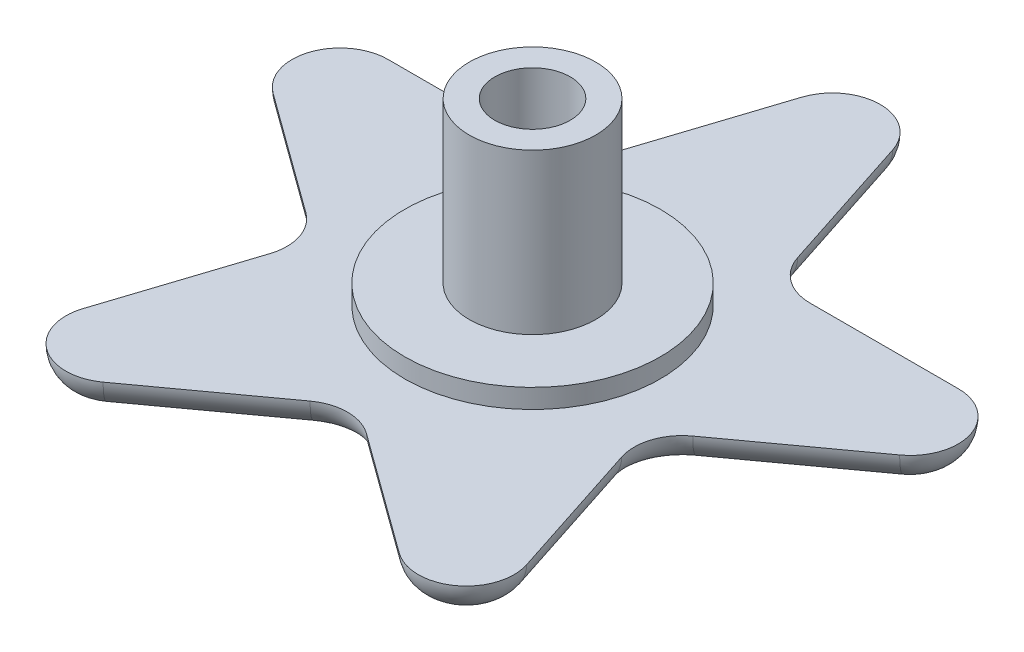
ISO-10303-21;
HEADER;
FILE_DESCRIPTION(('STEP AP214'),'2;1');
FILE_NAME('part.step','',(''),(''),'','','');
FILE_SCHEMA(('AUTOMOTIVE_DESIGN { 1 0 10303 214 1 1 1 1 }'));
ENDSEC;
DATA;
#1=APPLICATION_CONTEXT('core data for automotive mechanical design processes');
#2=APPLICATION_PROTOCOL_DEFINITION('international standard','automotive_design',2000,#1);
#3=PRODUCT_CONTEXT('',#1,'mechanical');
#4=PRODUCT('Part','Part','',(#3));
#5=PRODUCT_RELATED_PRODUCT_CATEGORY('part','',(#4));
#6=PRODUCT_DEFINITION_FORMATION('','',#4);
#7=PRODUCT_DEFINITION_CONTEXT('part definition',#1,'design');
#8=PRODUCT_DEFINITION('design','',#6,#7);
#9=PRODUCT_DEFINITION_SHAPE('','',#8);
#10=(LENGTH_UNIT() NAMED_UNIT(*) SI_UNIT(.MILLI.,.METRE.));
#11=(NAMED_UNIT(*) PLANE_ANGLE_UNIT() SI_UNIT($,.RADIAN.));
#12=(NAMED_UNIT(*) SI_UNIT($,.STERADIAN.) SOLID_ANGLE_UNIT());
#13=UNCERTAINTY_MEASURE_WITH_UNIT(LENGTH_MEASURE(1.E-05),#10,'distance_accuracy_value','');
#14=(GEOMETRIC_REPRESENTATION_CONTEXT(3) GLOBAL_UNCERTAINTY_ASSIGNED_CONTEXT((#13)) GLOBAL_UNIT_ASSIGNED_CONTEXT((#10,
#11,#12)) REPRESENTATION_CONTEXT('',''));
#15=CARTESIAN_POINT('',(0.,0.,0.));
#16=DIRECTION('',(0.,0.,1.));
#17=DIRECTION('',(1.,0.,0.));
#18=AXIS2_PLACEMENT_3D('',#15,#16,#17);
#19=CARTESIAN_POINT('',(-6.93491016549186,1.,2.2532889043741));
#20=DIRECTION('',(0.,1.,0.));
#21=DIRECTION('',(0.,0.,1.));
#22=AXIS2_PLACEMENT_3D('',#19,#20,#21);
#23=PLANE('',#22);
#24=CARTESIAN_POINT('',(0.,1.,0.));
#25=DIRECTION('',(0.,1.,0.));
#26=DIRECTION('',(0.,0.,1.));
#27=AXIS2_PLACEMENT_3D('',#24,#25,#26);
#28=CIRCLE('',#27,4.);
#29=CARTESIAN_POINT('',(0.,1.,4.));
#30=VERTEX_POINT('',#29);
#31=EDGE_CURVE('E433',#30,#30,#28,.T.);
#32=ORIENTED_EDGE('',*,*,#31,.F.);
#33=EDGE_LOOP('',(#32));
#34=FACE_BOUND('',#33,.T.);
#35=CARTESIAN_POINT('',(-6.93491016549186,1.,2.2532889043741));
#36=DIRECTION('',(0.,-1.,0.));
#37=DIRECTION('',(0.,0.,1.));
#38=AXIS2_PLACEMENT_3D('',#35,#36,#37);
#39=CIRCLE('',#38,1.5);
#40=CARTESIAN_POINT('',(-6.05323228705315,1.,1.03976341281168));
#41=VERTEX_POINT('',#40);
#42=CARTESIAN_POINT('',(-5.50832539104913,1.,2.71681439593653));
#43=VERTEX_POINT('',#42);
#44=EDGE_CURVE('E169',#41,#43,#39,.T.);
#45=ORIENTED_EDGE('',*,*,#44,.T.);
#46=DIRECTION('',(-0.309016994374948,0.,0.951056516295153));
#47=VECTOR('',#46,1.);
#48=CARTESIAN_POINT('',(-6.94116603336477,1.,7.126644452187));
#49=LINE('',#48,#47);
#50=CARTESIAN_POINT('',(-6.94116603336477,1.,7.126644452187));
#51=VERTEX_POINT('',#50);
#52=EDGE_CURVE('E172',#43,#51,#49,.T.);
#53=ORIENTED_EDGE('',*,*,#52,.T.);
#54=CARTESIAN_POINT('',(-5.51458125892206,1.,7.59016994374948));
#55=DIRECTION('',(0.,1.,0.));
#56=DIRECTION('',(0.,0.,-1.));
#57=AXIS2_PLACEMENT_3D('',#54,#55,#56);
#58=CIRCLE('',#57,1.5);
#59=CARTESIAN_POINT('',(-4.63290338048331,1.,8.80369543531187));
#60=VERTEX_POINT('',#59);
#61=EDGE_CURVE('E191',#51,#60,#58,.T.);
#62=ORIENTED_EDGE('',*,*,#61,.T.);
#63=DIRECTION('',(0.809016994374948,0.,-0.587785252292473));
#64=VECTOR('',#63,1.);
#65=CARTESIAN_POINT('',(-0.881677878438718,1.,6.07827057593822));
#66=LINE('',#65,#64);
#67=CARTESIAN_POINT('',(-0.881677878438718,1.,6.07827057593822));
#68=VERTEX_POINT('',#67);
#69=EDGE_CURVE('E193',#60,#68,#66,.T.);
#70=ORIENTED_EDGE('',*,*,#69,.T.);
#71=CARTESIAN_POINT('',(0.,1.,7.29179606750063));
#72=DIRECTION('',(0.,-1.,0.));
#73=DIRECTION('',(0.,0.,1.));
#74=AXIS2_PLACEMENT_3D('',#71,#72,#73);
#75=CIRCLE('',#74,1.5);
#76=CARTESIAN_POINT('',(0.881677878438714,1.,6.07827057593822));
#77=VERTEX_POINT('',#76);
#78=EDGE_CURVE('E198',#68,#77,#75,.T.);
#79=ORIENTED_EDGE('',*,*,#78,.T.);
#80=DIRECTION('',(0.809016994374947,0.,0.587785252292474));
#81=VECTOR('',#80,1.);
#82=CARTESIAN_POINT('',(4.6329033804833,1.,8.80369543531187));
#83=LINE('',#82,#81);
#84=CARTESIAN_POINT('',(4.6329033804833,1.,8.80369543531187));
#85=VERTEX_POINT('',#84);
#86=EDGE_CURVE('E200',#77,#85,#83,.T.);
#87=ORIENTED_EDGE('',*,*,#86,.T.);
#88=CARTESIAN_POINT('',(5.51458125892205,1.,7.59016994374948));
#89=DIRECTION('',(0.,1.,0.));
#90=DIRECTION('',(0.,0.,-1.));
#91=AXIS2_PLACEMENT_3D('',#88,#89,#90);
#92=CIRCLE('',#91,1.5);
#93=CARTESIAN_POINT('',(6.94116603336476,1.,7.12664445218701));
#94=VERTEX_POINT('',#93);
#95=EDGE_CURVE('E202',#85,#94,#92,.T.);
#96=ORIENTED_EDGE('',*,*,#95,.T.);
#97=DIRECTION('',(-0.309016994374947,0.,-0.951056516295154));
#98=VECTOR('',#97,1.);
#99=CARTESIAN_POINT('',(5.50832539104912,1.,2.71681439593654));
#100=LINE('',#99,#98);
#101=CARTESIAN_POINT('',(5.50832539104912,1.,2.71681439593654));
#102=VERTEX_POINT('',#101);
#103=EDGE_CURVE('E204',#94,#102,#100,.T.);
#104=ORIENTED_EDGE('',*,*,#103,.T.);
#105=CARTESIAN_POINT('',(6.93491016549185,1.,2.25328890437411));
#106=DIRECTION('',(0.,-1.,0.));
#107=DIRECTION('',(0.,0.,1.));
#108=AXIS2_PLACEMENT_3D('',#105,#106,#107);
#109=CIRCLE('',#108,1.5);
#110=CARTESIAN_POINT('',(6.05323228705315,1.,1.03976341281168));
#111=VERTEX_POINT('',#110);
#112=EDGE_CURVE('E206',#102,#111,#109,.T.);
#113=ORIENTED_EDGE('',*,*,#112,.T.);
#114=DIRECTION('',(0.809016994374948,0.,-0.587785252292473));
#115=VECTOR('',#114,1.);
#116=CARTESIAN_POINT('',(9.80445778909773,1.,-1.68566144656197));
#117=LINE('',#116,#115);
#118=CARTESIAN_POINT('',(9.80445778909773,1.,-1.68566144656197));
#119=VERTEX_POINT('',#118);
#120=EDGE_CURVE('E208',#111,#119,#117,.T.);
#121=ORIENTED_EDGE('',*,*,#120,.T.);
#122=CARTESIAN_POINT('',(8.92277991065907,1.,-2.89918693812442));
#123=DIRECTION('',(0.,1.,0.));
#124=DIRECTION('',(0.,0.,-1.));
#125=AXIS2_PLACEMENT_3D('',#122,#123,#124);
#126=CIRCLE('',#125,1.5);
#127=CARTESIAN_POINT('',(8.92277991065902,1.,-4.39918693812442));
#128=VERTEX_POINT('',#127);
#129=EDGE_CURVE('E210',#119,#128,#126,.T.);
#130=ORIENTED_EDGE('',*,*,#129,.T.);
#131=DIRECTION('',(-1.,0.,0.));
#132=VECTOR('',#131,1.);
#133=CARTESIAN_POINT('',(4.28601019120113,1.,-4.39918693812442));
#134=LINE('',#133,#132);
#135=CARTESIAN_POINT('',(4.28601019120113,1.,-4.39918693812442));
#136=VERTEX_POINT('',#135);
#137=EDGE_CURVE('E212',#128,#136,#134,.T.);
#138=ORIENTED_EDGE('',*,*,#137,.T.);
#139=CARTESIAN_POINT('',(4.28601019120112,1.,-5.89918693812442));
#140=DIRECTION('',(0.,-1.,0.));
#141=DIRECTION('',(0.,0.,1.));
#142=AXIS2_PLACEMENT_3D('',#139,#140,#141);
#143=CIRCLE('',#142,1.5);
#144=CARTESIAN_POINT('',(2.85942541675839,1.,-5.43566144656201));
#145=VERTEX_POINT('',#144);
#146=EDGE_CURVE('E214',#136,#145,#143,.T.);
#147=ORIENTED_EDGE('',*,*,#146,.T.);
#148=DIRECTION('',(-0.309016994374947,0.,-0.951056516295153));
#149=VECTOR('',#148,1.);
#150=CARTESIAN_POINT('',(1.42658477444275,1.,-9.84549150281247));
#151=LINE('',#150,#149);
#152=CARTESIAN_POINT('',(1.42658477444275,1.,-9.84549150281247));
#153=VERTEX_POINT('',#152);
#154=EDGE_CURVE('E216',#145,#153,#151,.T.);
#155=ORIENTED_EDGE('',*,*,#154,.T.);
#156=CARTESIAN_POINT('',(0.,1.,-9.3819660112501));
#157=DIRECTION('',(0.,1.,0.));
#158=DIRECTION('',(0.,0.,1.));
#159=AXIS2_PLACEMENT_3D('',#156,#157,#158);
#160=CIRCLE('',#159,1.5);
#161=CARTESIAN_POINT('',(-1.42658477444275,1.,-9.84549150281248));
#162=VERTEX_POINT('',#161);
#163=EDGE_CURVE('E218',#153,#162,#160,.T.);
#164=ORIENTED_EDGE('',*,*,#163,.T.);
#165=DIRECTION('',(-0.309016994374948,0.,0.951056516295153));
#166=VECTOR('',#165,1.);
#167=CARTESIAN_POINT('',(-2.85942541675839,1.,-5.43566144656201));
#168=LINE('',#167,#166);
#169=CARTESIAN_POINT('',(-2.85942541675839,1.,-5.43566144656201));
#170=VERTEX_POINT('',#169);
#171=EDGE_CURVE('E220',#162,#170,#168,.T.);
#172=ORIENTED_EDGE('',*,*,#171,.T.);
#173=CARTESIAN_POINT('',(-4.28601019120112,1.,-5.89918693812443));
#174=DIRECTION('',(0.,-1.,0.));
#175=DIRECTION('',(0.,0.,1.));
#176=AXIS2_PLACEMENT_3D('',#173,#174,#175);
#177=CIRCLE('',#176,1.5);
#178=CARTESIAN_POINT('',(-4.28601019120113,1.,-4.39918693812443));
#179=VERTEX_POINT('',#178);
#180=EDGE_CURVE('E222',#170,#179,#177,.T.);
#181=ORIENTED_EDGE('',*,*,#180,.T.);
#182=DIRECTION('',(-1.,0.,0.));
#183=VECTOR('',#182,1.);
#184=CARTESIAN_POINT('',(-8.92277991065901,1.,-4.39918693812443));
#185=LINE('',#184,#183);
#186=CARTESIAN_POINT('',(-8.92277991065901,1.,-4.39918693812443));
#187=VERTEX_POINT('',#186);
#188=EDGE_CURVE('E224',#179,#187,#185,.T.);
#189=ORIENTED_EDGE('',*,*,#188,.T.);
#190=CARTESIAN_POINT('',(-8.92277991065907,1.,-2.89918693812443));
#191=DIRECTION('',(0.,1.,0.));
#192=DIRECTION('',(0.,0.,-1.));
#193=AXIS2_PLACEMENT_3D('',#190,#191,#192);
#194=CIRCLE('',#193,1.5);
#195=CARTESIAN_POINT('',(-9.80445778909773,1.,-1.68566144656197));
#196=VERTEX_POINT('',#195);
#197=EDGE_CURVE('E226',#187,#196,#194,.T.);
#198=ORIENTED_EDGE('',*,*,#197,.T.);
#199=DIRECTION('',(0.809016994374947,0.,0.587785252292473));
#200=VECTOR('',#199,1.);
#201=CARTESIAN_POINT('',(-6.05323228705315,1.,1.03976341281168));
#202=LINE('',#201,#200);
#203=EDGE_CURVE('E174',#196,#41,#202,.T.);
#204=ORIENTED_EDGE('',*,*,#203,.T.);
#205=EDGE_LOOP('',(#45,#53,#62,#70,#79,#87,#96,#104,#113,#121,#130,#138,#147,#155,#164,#172,
#181,#189,#198,#204));
#206=FACE_BOUND('',#205,.T.);
#207=ADVANCED_FACE('F32',(#34,#206),#23,.T.);
#208=CARTESIAN_POINT('',(-6.93491016549186,0.,2.2532889043741));
#209=DIRECTION('',(0.,1.,0.));
#210=DIRECTION('',(0.,0.,1.));
#211=AXIS2_PLACEMENT_3D('',#208,#209,#210);
#212=PLANE('',#211);
#213=CARTESIAN_POINT('',(-5.51458125892206,0.,7.59016994374948));
#214=DIRECTION('',(0.,1.,0.));
#215=DIRECTION('',(0.,0.,1.));
#216=AXIS2_PLACEMENT_3D('',#213,#214,#215);
#217=CIRCLE('',#216,0.5);
#218=CARTESIAN_POINT('',(-5.22068863277581,0.,7.99467844093694));
#219=VERTEX_POINT('',#218);
#220=CARTESIAN_POINT('',(-5.99010951706962,0.,7.43566144656195));
#221=VERTEX_POINT('',#220);
#222=EDGE_CURVE('E47',#219,#221,#217,.F.);
#223=ORIENTED_EDGE('',*,*,#222,.T.);
#224=DIRECTION('',(-0.309016994374948,0.,0.951056516295153));
#225=VECTOR('',#224,1.);
#226=CARTESIAN_POINT('',(-4.55726887475397,0.,3.02583139031147));
#227=LINE('',#226,#225);
#228=CARTESIAN_POINT('',(-4.55726887475397,0.,3.02583139031148));
#229=VERTEX_POINT('',#228);
#230=EDGE_CURVE('E40',#221,#229,#227,.F.);
#231=ORIENTED_EDGE('',*,*,#230,.T.);
#232=CARTESIAN_POINT('',(-6.93491016549186,0.,2.2532889043741));
#233=DIRECTION('',(0.,1.,0.));
#234=DIRECTION('',(0.,0.,1.));
#235=AXIS2_PLACEMENT_3D('',#232,#233,#234);
#236=CIRCLE('',#235,2.5);
#237=CARTESIAN_POINT('',(-5.46544703476068,0.,0.230746418436732));
#238=VERTEX_POINT('',#237);
#239=EDGE_CURVE('E183',#229,#238,#236,.T.);
#240=ORIENTED_EDGE('',*,*,#239,.T.);
#241=DIRECTION('',(0.809016994374947,0.,0.587785252292473));
#242=VECTOR('',#241,1.);
#243=CARTESIAN_POINT('',(-5.46544703476067,0.,0.230746418436736));
#244=LINE('',#243,#242);
#245=CARTESIAN_POINT('',(-9.21667253680529,0.,-2.49467844093694));
#246=VERTEX_POINT('',#245);
#247=EDGE_CURVE('E230',#238,#246,#244,.F.);
#248=ORIENTED_EDGE('',*,*,#247,.T.);
#249=CARTESIAN_POINT('',(-8.92277991065907,0.,-2.89918693812443));
#250=DIRECTION('',(0.,1.,0.));
#251=DIRECTION('',(0.,0.,1.));
#252=AXIS2_PLACEMENT_3D('',#249,#250,#251);
#253=CIRCLE('',#252,0.5);
#254=CARTESIAN_POINT('',(-8.92277991065901,0.,-3.39918693812443));
#255=VERTEX_POINT('',#254);
#256=EDGE_CURVE('E232',#246,#255,#253,.F.);
#257=ORIENTED_EDGE('',*,*,#256,.T.);
#258=DIRECTION('',(-1.,0.,0.));
#259=VECTOR('',#258,1.);
#260=CARTESIAN_POINT('',(-6.93491016549186,0.,-3.39918693812443));
#261=LINE('',#260,#259);
#262=CARTESIAN_POINT('',(-4.28601019120114,0.,-3.39918693812443));
#263=VERTEX_POINT('',#262);
#264=EDGE_CURVE('E234',#255,#263,#261,.F.);
#265=ORIENTED_EDGE('',*,*,#264,.T.);
#266=CARTESIAN_POINT('',(-4.28601019120112,0.,-5.89918693812443));
#267=DIRECTION('',(0.,1.,0.));
#268=DIRECTION('',(0.,0.,1.));
#269=AXIS2_PLACEMENT_3D('',#266,#267,#268);
#270=CIRCLE('',#269,2.5);
#271=CARTESIAN_POINT('',(-1.90836890046324,0.,-5.12664445218707));
#272=VERTEX_POINT('',#271);
#273=EDGE_CURVE('E236',#263,#272,#270,.T.);
#274=ORIENTED_EDGE('',*,*,#273,.T.);
#275=DIRECTION('',(-0.309016994374948,0.,0.951056516295154));
#276=VECTOR('',#275,1.);
#277=CARTESIAN_POINT('',(-4.55726887475397,0.,3.02583139031147));
#278=LINE('',#277,#276);
#279=CARTESIAN_POINT('',(-0.475528258147584,0.,-9.53647450843756));
#280=VERTEX_POINT('',#279);
#281=EDGE_CURVE('E238',#272,#280,#278,.F.);
#282=ORIENTED_EDGE('',*,*,#281,.T.);
#283=CARTESIAN_POINT('',(0.,0.,-9.3819660112501));
#284=DIRECTION('',(0.,1.,0.));
#285=DIRECTION('',(0.,0.,1.));
#286=AXIS2_PLACEMENT_3D('',#283,#284,#285);
#287=CIRCLE('',#286,0.500000000000001);
#288=CARTESIAN_POINT('',(0.475528258147594,0.,-9.53647450843753));
#289=VERTEX_POINT('',#288);
#290=EDGE_CURVE('E240',#280,#289,#287,.F.);
#291=ORIENTED_EDGE('',*,*,#290,.T.);
#292=DIRECTION('',(-0.309016994374947,0.,-0.951056516295154));
#293=VECTOR('',#292,1.);
#294=CARTESIAN_POINT('',(3.2328188876086,0.,-1.05040653093779));
#295=LINE('',#294,#293);
#296=CARTESIAN_POINT('',(1.90836890046323,0.,-5.12664445218707));
#297=VERTEX_POINT('',#296);
#298=EDGE_CURVE('E242',#289,#297,#295,.F.);
#299=ORIENTED_EDGE('',*,*,#298,.T.);
#300=CARTESIAN_POINT('',(4.28601019120112,0.,-5.89918693812442));
#301=DIRECTION('',(0.,1.,0.));
#302=DIRECTION('',(0.,0.,1.));
#303=AXIS2_PLACEMENT_3D('',#300,#301,#302);
#304=CIRCLE('',#303,2.5);
#305=CARTESIAN_POINT('',(4.28601019120113,0.,-3.39918693812442));
#306=VERTEX_POINT('',#305);
#307=EDGE_CURVE('E244',#297,#306,#304,.T.);
#308=ORIENTED_EDGE('',*,*,#307,.T.);
#309=DIRECTION('',(-1.,0.,0.));
#310=VECTOR('',#309,1.);
#311=CARTESIAN_POINT('',(-6.93491016549186,0.,-3.39918693812442));
#312=LINE('',#311,#310);
#313=CARTESIAN_POINT('',(8.92277991065905,0.,-3.39918693812442));
#314=VERTEX_POINT('',#313);
#315=EDGE_CURVE('E246',#306,#314,#312,.F.);
#316=ORIENTED_EDGE('',*,*,#315,.T.);
#317=CARTESIAN_POINT('',(8.92277991065907,0.,-2.89918693812442));
#318=DIRECTION('',(0.,1.,0.));
#319=DIRECTION('',(0.,0.,1.));
#320=AXIS2_PLACEMENT_3D('',#317,#318,#319);
#321=CIRCLE('',#320,0.5);
#322=CARTESIAN_POINT('',(9.21667253680526,0.,-2.49467844093691));
#323=VERTEX_POINT('',#322);
#324=EDGE_CURVE('E248',#314,#323,#321,.F.);
#325=ORIENTED_EDGE('',*,*,#324,.T.);
#326=DIRECTION('',(0.809016994374948,0.,-0.587785252292473));
#327=VECTOR('',#326,1.);
#328=CARTESIAN_POINT('',(-3.61246822633175,0.,6.82623792124926));
#329=LINE('',#328,#327);
#330=CARTESIAN_POINT('',(5.46544703476068,0.,0.230746418436731));
#331=VERTEX_POINT('',#330);
#332=EDGE_CURVE('E250',#323,#331,#329,.F.);
#333=ORIENTED_EDGE('',*,*,#332,.T.);
#334=CARTESIAN_POINT('',(6.93491016549185,0.,2.25328890437411));
#335=DIRECTION('',(0.,1.,0.));
#336=DIRECTION('',(0.,0.,1.));
#337=AXIS2_PLACEMENT_3D('',#334,#335,#336);
#338=CIRCLE('',#337,2.5);
#339=CARTESIAN_POINT('',(4.55726887475397,0.,3.02583139031148));
#340=VERTEX_POINT('',#339);
#341=EDGE_CURVE('E252',#331,#340,#338,.T.);
#342=ORIENTED_EDGE('',*,*,#341,.T.);
#343=DIRECTION('',(-0.309016994374947,0.,-0.951056516295154));
#344=VECTOR('',#343,1.);
#345=CARTESIAN_POINT('',(3.2328188876086,0.,-1.05040653093779));
#346=LINE('',#345,#344);
#347=CARTESIAN_POINT('',(5.99010951706962,0.,7.43566144656199));
#348=VERTEX_POINT('',#347);
#349=EDGE_CURVE('E254',#340,#348,#346,.F.);
#350=ORIENTED_EDGE('',*,*,#349,.T.);
#351=CARTESIAN_POINT('',(5.51458125892205,0.,7.59016994374948));
#352=DIRECTION('',(0.,1.,0.));
#353=DIRECTION('',(0.,0.,1.));
#354=AXIS2_PLACEMENT_3D('',#351,#352,#353);
#355=CIRCLE('',#354,0.5);
#356=CARTESIAN_POINT('',(5.22068863277577,0.,7.99467844093692));
#357=VERTEX_POINT('',#356);
#358=EDGE_CURVE('E256',#348,#357,#355,.F.);
#359=ORIENTED_EDGE('',*,*,#358,.T.);
#360=DIRECTION('',(0.809016994374947,0.,0.587785252292474));
#361=VECTOR('',#360,1.);
#362=CARTESIAN_POINT('',(-5.46544703476067,0.,0.230746418436732));
#363=LINE('',#362,#361);
#364=CARTESIAN_POINT('',(1.46946313073119,0.,5.26925358156327));
#365=VERTEX_POINT('',#364);
#366=EDGE_CURVE('E258',#357,#365,#363,.F.);
#367=ORIENTED_EDGE('',*,*,#366,.T.);
#368=CARTESIAN_POINT('',(0.,0.,7.29179606750063));
#369=DIRECTION('',(0.,1.,0.));
#370=DIRECTION('',(0.,0.,1.));
#371=AXIS2_PLACEMENT_3D('',#368,#369,#370);
#372=CIRCLE('',#371,2.5);
#373=CARTESIAN_POINT('',(-1.46946313073119,0.,5.26925358156327));
#374=VERTEX_POINT('',#373);
#375=EDGE_CURVE('E260',#365,#374,#372,.T.);
#376=ORIENTED_EDGE('',*,*,#375,.T.);
#377=DIRECTION('',(0.809016994374948,0.,-0.587785252292473));
#378=VECTOR('',#377,1.);
#379=CARTESIAN_POINT('',(-3.61246822633175,0.,6.82623792124927));
#380=LINE('',#379,#378);
#381=EDGE_CURVE('E52',#374,#219,#380,.F.);
#382=ORIENTED_EDGE('',*,*,#381,.T.);
#383=EDGE_LOOP('',(#223,#231,#240,#248,#257,#265,#274,#282,#291,#299,#308,#316,#325,#333,#342,
#350,#359,#367,#376,#382));
#384=FACE_BOUND('',#383,.T.);
#385=ADVANCED_FACE('F327',(#384),#212,.F.);
#386=CARTESIAN_POINT('',(4.28601019120113,1.,-3.39918693812442));
#387=DIRECTION('',(-1.,0.,0.));
#388=DIRECTION('',(0.,0.,1.));
#389=AXIS2_PLACEMENT_3D('',#386,#387,#388);
#390=CYLINDRICAL_SURFACE('',#389,1.);
#391=CARTESIAN_POINT('',(8.92277991065905,1.,-3.39918693812442));
#392=DIRECTION('',(1.,0.,0.));
#393=DIRECTION('',(0.,0.,-1.));
#394=AXIS2_PLACEMENT_3D('',#391,#392,#393);
#395=CIRCLE('',#394,1.);
#396=EDGE_CURVE('E313',#314,#128,#395,.T.);
#397=ORIENTED_EDGE('',*,*,#396,.F.);
#398=ORIENTED_EDGE('',*,*,#315,.F.);
#399=CARTESIAN_POINT('',(4.28601019120113,1.,-3.39918693812442));
#400=DIRECTION('',(-1.,0.,0.));
#401=DIRECTION('',(0.,0.,1.));
#402=AXIS2_PLACEMENT_3D('',#399,#400,#401);
#403=CIRCLE('',#402,1.);
#404=EDGE_CURVE('E178',#136,#306,#403,.T.);
#405=ORIENTED_EDGE('',*,*,#404,.F.);
#406=ORIENTED_EDGE('',*,*,#137,.F.);
#407=EDGE_LOOP('',(#397,#398,#405,#406));
#408=FACE_BOUND('',#407,.T.);
#409=ADVANCED_FACE('F34',(#408),#390,.T.);
#410=CARTESIAN_POINT('',(4.28601019120112,1.,-5.89918693812442));
#411=DIRECTION('',(0.,1.,0.));
#412=DIRECTION('',(0.,0.,1.));
#413=AXIS2_PLACEMENT_3D('',#410,#411,#412);
#414=TOROIDAL_SURFACE('',#413,2.5,1.);
#415=ORIENTED_EDGE('',*,*,#404,.T.);
#416=ORIENTED_EDGE('',*,*,#307,.F.);
#417=CARTESIAN_POINT('',(1.90836890046323,1.,-5.12664445218707));
#418=DIRECTION('',(-0.309016994374942,0.,-0.951056516295155));
#419=DIRECTION('',(-0.951056516295155,0.,0.309016994374942));
#420=AXIS2_PLACEMENT_3D('',#417,#418,#419);
#421=CIRCLE('',#420,1.);
#422=EDGE_CURVE('E310',#145,#297,#421,.T.);
#423=ORIENTED_EDGE('',*,*,#422,.F.);
#424=ORIENTED_EDGE('',*,*,#146,.F.);
#425=EDGE_LOOP('',(#415,#416,#423,#424));
#426=FACE_BOUND('',#425,.T.);
#427=ADVANCED_FACE('F320',(#426),#414,.T.);
#428=CARTESIAN_POINT('',(8.92277991065907,1.,-2.89918693812442));
#429=DIRECTION('',(0.,1.,0.));
#430=DIRECTION('',(0.,0.,1.));
#431=AXIS2_PLACEMENT_3D('',#428,#429,#430);
#432=DEGENERATE_TOROIDAL_SURFACE('',#431,0.5,1.,.T.);
#433=ORIENTED_EDGE('',*,*,#396,.T.);
#434=ORIENTED_EDGE('',*,*,#129,.F.);
#435=CARTESIAN_POINT('',(9.21667253680526,1.,-2.49467844093691));
#436=DIRECTION('',(-0.809016994374948,0.,0.587785252292472));
#437=DIRECTION('',(0.587785252292472,0.,0.809016994374948));
#438=AXIS2_PLACEMENT_3D('',#435,#436,#437);
#439=CIRCLE('',#438,1.);
#440=EDGE_CURVE('E307',#323,#119,#439,.T.);
#441=ORIENTED_EDGE('',*,*,#440,.F.);
#442=ORIENTED_EDGE('',*,*,#324,.F.);
#443=EDGE_LOOP('',(#433,#434,#441,#442));
#444=FACE_BOUND('',#443,.T.);
#445=ADVANCED_FACE('F344',(#444),#432,.T.);
#446=CARTESIAN_POINT('',(0.475528258147594,1.,-9.53647450843753));
#447=DIRECTION('',(-0.309016994374947,0.,-0.951056516295154));
#448=DIRECTION('',(-0.951056516295154,0.,0.309016994374947));
#449=AXIS2_PLACEMENT_3D('',#446,#447,#448);
#450=CYLINDRICAL_SURFACE('',#449,1.);
#451=ORIENTED_EDGE('',*,*,#422,.T.);
#452=ORIENTED_EDGE('',*,*,#298,.F.);
#453=CARTESIAN_POINT('',(0.475528258147594,1.,-9.53647450843753));
#454=DIRECTION('',(-0.309016994374947,0.,-0.951056516295154));
#455=DIRECTION('',(-0.951056516295154,0.,0.309016994374947));
#456=AXIS2_PLACEMENT_3D('',#453,#454,#455);
#457=CIRCLE('',#456,1.);
#458=EDGE_CURVE('E304',#153,#289,#457,.T.);
#459=ORIENTED_EDGE('',*,*,#458,.F.);
#460=ORIENTED_EDGE('',*,*,#154,.F.);
#461=EDGE_LOOP('',(#451,#452,#459,#460));
#462=FACE_BOUND('',#461,.T.);
#463=ADVANCED_FACE('F333',(#462),#450,.T.);
#464=CARTESIAN_POINT('',(9.21667253680526,1.,-2.49467844093691));
#465=DIRECTION('',(0.809016994374948,0.,-0.587785252292473));
#466=DIRECTION('',(-0.587785252292473,0.,-0.809016994374948));
#467=AXIS2_PLACEMENT_3D('',#464,#465,#466);
#468=CYLINDRICAL_SURFACE('',#467,1.);
#469=ORIENTED_EDGE('',*,*,#440,.T.);
#470=ORIENTED_EDGE('',*,*,#120,.F.);
#471=CARTESIAN_POINT('',(5.46544703476068,1.,0.230746418436731));
#472=DIRECTION('',(-0.809016994374951,0.,0.587785252292468));
#473=DIRECTION('',(0.587785252292468,0.,0.809016994374951));
#474=AXIS2_PLACEMENT_3D('',#471,#472,#473);
#475=CIRCLE('',#474,1.);
#476=EDGE_CURVE('E301',#331,#111,#475,.T.);
#477=ORIENTED_EDGE('',*,*,#476,.F.);
#478=ORIENTED_EDGE('',*,*,#332,.F.);
#479=EDGE_LOOP('',(#469,#470,#477,#478));
#480=FACE_BOUND('',#479,.T.);
#481=ADVANCED_FACE('F347',(#480),#468,.T.);
#482=CARTESIAN_POINT('',(0.,1.,-9.3819660112501));
#483=DIRECTION('',(0.,1.,0.));
#484=DIRECTION('',(0.,0.,1.));
#485=AXIS2_PLACEMENT_3D('',#482,#483,#484);
#486=DEGENERATE_TOROIDAL_SURFACE('',#485,0.500000000000001,1.,.T.);
#487=ORIENTED_EDGE('',*,*,#458,.T.);
#488=ORIENTED_EDGE('',*,*,#290,.F.);
#489=CARTESIAN_POINT('',(-0.475528258147584,1.,-9.53647450843756));
#490=DIRECTION('',(-0.309016994374914,0.,0.951056516295164));
#491=DIRECTION('',(0.951056516295164,0.,0.309016994374914));
#492=AXIS2_PLACEMENT_3D('',#489,#490,#491);
#493=CIRCLE('',#492,1.);
#494=EDGE_CURVE('E298',#162,#280,#493,.T.);
#495=ORIENTED_EDGE('',*,*,#494,.F.);
#496=ORIENTED_EDGE('',*,*,#163,.F.);
#497=EDGE_LOOP('',(#487,#488,#495,#496));
#498=FACE_BOUND('',#497,.T.);
#499=ADVANCED_FACE('F337',(#498),#486,.T.);
#500=CARTESIAN_POINT('',(6.93491016549185,1.,2.25328890437411));
#501=DIRECTION('',(0.,1.,0.));
#502=DIRECTION('',(0.,0.,1.));
#503=AXIS2_PLACEMENT_3D('',#500,#501,#502);
#504=TOROIDAL_SURFACE('',#503,2.5,1.);
#505=ORIENTED_EDGE('',*,*,#476,.T.);
#506=ORIENTED_EDGE('',*,*,#112,.F.);
#507=CARTESIAN_POINT('',(4.55726887475397,1.,3.02583139031148));
#508=DIRECTION('',(0.309016994374947,0.,0.951056516295154));
#509=DIRECTION('',(0.951056516295154,0.,-0.309016994374947));
#510=AXIS2_PLACEMENT_3D('',#507,#508,#509);
#511=CIRCLE('',#510,1.);
#512=EDGE_CURVE('E295',#340,#102,#511,.T.);
#513=ORIENTED_EDGE('',*,*,#512,.F.);
#514=ORIENTED_EDGE('',*,*,#341,.F.);
#515=EDGE_LOOP('',(#505,#506,#513,#514));
#516=FACE_BOUND('',#515,.T.);
#517=ADVANCED_FACE('F355',(#516),#504,.T.);
#518=CARTESIAN_POINT('',(-1.90836890046324,1.,-5.12664445218707));
#519=DIRECTION('',(-0.309016994374948,0.,0.951056516295154));
#520=DIRECTION('',(0.951056516295154,0.,0.309016994374948));
#521=AXIS2_PLACEMENT_3D('',#518,#519,#520);
#522=CYLINDRICAL_SURFACE('',#521,1.);
#523=ORIENTED_EDGE('',*,*,#494,.T.);
#524=ORIENTED_EDGE('',*,*,#281,.F.);
#525=CARTESIAN_POINT('',(-1.90836890046324,1.,-5.12664445218707));
#526=DIRECTION('',(-0.309016994374947,0.,0.951056516295154));
#527=DIRECTION('',(0.951056516295154,0.,0.309016994374948));
#528=AXIS2_PLACEMENT_3D('',#525,#526,#527);
#529=CIRCLE('',#528,1.);
#530=EDGE_CURVE('E292',#170,#272,#529,.T.);
#531=ORIENTED_EDGE('',*,*,#530,.F.);
#532=ORIENTED_EDGE('',*,*,#171,.F.);
#533=EDGE_LOOP('',(#523,#524,#531,#532));
#534=FACE_BOUND('',#533,.T.);
#535=ADVANCED_FACE('F575',(#534),#522,.T.);
#536=CARTESIAN_POINT('',(4.55726887475397,1.,3.02583139031148));
#537=DIRECTION('',(-0.309016994374947,0.,-0.951056516295154));
#538=DIRECTION('',(-0.951056516295154,0.,0.309016994374947));
#539=AXIS2_PLACEMENT_3D('',#536,#537,#538);
#540=CYLINDRICAL_SURFACE('',#539,1.);
#541=ORIENTED_EDGE('',*,*,#512,.T.);
#542=ORIENTED_EDGE('',*,*,#103,.F.);
#543=CARTESIAN_POINT('',(5.99010951706962,1.,7.43566144656199));
#544=DIRECTION('',(0.309016994374982,0.,0.951056516295142));
#545=DIRECTION('',(0.951056516295142,0.,-0.309016994374982));
#546=AXIS2_PLACEMENT_3D('',#543,#544,#545);
#547=CIRCLE('',#546,1.);
#548=EDGE_CURVE('E289',#348,#94,#547,.T.);
#549=ORIENTED_EDGE('',*,*,#548,.F.);
#550=ORIENTED_EDGE('',*,*,#349,.F.);
#551=EDGE_LOOP('',(#541,#542,#549,#550));
#552=FACE_BOUND('',#551,.T.);
#553=ADVANCED_FACE('F358',(#552),#540,.T.);
#554=CARTESIAN_POINT('',(-4.28601019120112,1.,-5.89918693812443));
#555=DIRECTION('',(0.,1.,0.));
#556=DIRECTION('',(0.,0.,1.));
#557=AXIS2_PLACEMENT_3D('',#554,#555,#556);
#558=TOROIDAL_SURFACE('',#557,2.5,1.);
#559=ORIENTED_EDGE('',*,*,#530,.T.);
#560=ORIENTED_EDGE('',*,*,#273,.F.);
#561=CARTESIAN_POINT('',(-4.28601019120114,1.,-3.39918693812443));
#562=DIRECTION('',(-1.,0.,0.));
#563=DIRECTION('',(0.,0.,1.));
#564=AXIS2_PLACEMENT_3D('',#561,#562,#563);
#565=CIRCLE('',#564,1.);
#566=EDGE_CURVE('E286',#179,#263,#565,.T.);
#567=ORIENTED_EDGE('',*,*,#566,.F.);
#568=ORIENTED_EDGE('',*,*,#180,.F.);
#569=EDGE_LOOP('',(#559,#560,#567,#568));
#570=FACE_BOUND('',#569,.T.);
#571=ADVANCED_FACE('F557',(#570),#558,.T.);
#572=CARTESIAN_POINT('',(5.51458125892205,1.,7.59016994374948));
#573=DIRECTION('',(0.,1.,0.));
#574=DIRECTION('',(0.,0.,1.));
#575=AXIS2_PLACEMENT_3D('',#572,#573,#574);
#576=DEGENERATE_TOROIDAL_SURFACE('',#575,0.5,1.,.T.);
#577=ORIENTED_EDGE('',*,*,#548,.T.);
#578=ORIENTED_EDGE('',*,*,#95,.F.);
#579=CARTESIAN_POINT('',(5.22068863277577,1.,7.99467844093692));
#580=DIRECTION('',(-0.809016994374947,0.,-0.587785252292473));
#581=DIRECTION('',(-0.587785252292473,0.,0.809016994374947));
#582=AXIS2_PLACEMENT_3D('',#579,#580,#581);
#583=CIRCLE('',#582,1.);
#584=EDGE_CURVE('E283',#357,#85,#583,.T.);
#585=ORIENTED_EDGE('',*,*,#584,.F.);
#586=ORIENTED_EDGE('',*,*,#358,.F.);
#587=EDGE_LOOP('',(#577,#578,#585,#586));
#588=FACE_BOUND('',#587,.T.);
#589=ADVANCED_FACE('F363',(#588),#576,.T.);
#590=CARTESIAN_POINT('',(-8.92277991065901,1.,-3.39918693812443));
#591=DIRECTION('',(-1.,0.,0.));
#592=DIRECTION('',(0.,0.,1.));
#593=AXIS2_PLACEMENT_3D('',#590,#591,#592);
#594=CYLINDRICAL_SURFACE('',#593,1.);
#595=ORIENTED_EDGE('',*,*,#566,.T.);
#596=ORIENTED_EDGE('',*,*,#264,.F.);
#597=CARTESIAN_POINT('',(-8.92277991065901,1.,-3.39918693812443));
#598=DIRECTION('',(-1.,0.,0.));
#599=DIRECTION('',(0.,0.,1.));
#600=AXIS2_PLACEMENT_3D('',#597,#598,#599);
#601=CIRCLE('',#600,1.);
#602=EDGE_CURVE('E280',#187,#255,#601,.T.);
#603=ORIENTED_EDGE('',*,*,#602,.F.);
#604=ORIENTED_EDGE('',*,*,#188,.F.);
#605=EDGE_LOOP('',(#595,#596,#603,#604));
#606=FACE_BOUND('',#605,.T.);
#607=ADVANCED_FACE('F539',(#606),#594,.T.);
#608=CARTESIAN_POINT('',(5.22068863277577,1.,7.99467844093692));
#609=DIRECTION('',(0.809016994374947,0.,0.587785252292474));
#610=DIRECTION('',(0.587785252292474,0.,-0.809016994374947));
#611=AXIS2_PLACEMENT_3D('',#608,#609,#610);
#612=CYLINDRICAL_SURFACE('',#611,1.);
#613=ORIENTED_EDGE('',*,*,#584,.T.);
#614=ORIENTED_EDGE('',*,*,#86,.F.);
#615=CARTESIAN_POINT('',(1.46946313073119,1.,5.26925358156327));
#616=DIRECTION('',(-0.809016994374944,0.,-0.587785252292478));
#617=DIRECTION('',(-0.587785252292478,0.,0.809016994374944));
#618=AXIS2_PLACEMENT_3D('',#615,#616,#617);
#619=CIRCLE('',#618,1.);
#620=EDGE_CURVE('E277',#365,#77,#619,.T.);
#621=ORIENTED_EDGE('',*,*,#620,.F.);
#622=ORIENTED_EDGE('',*,*,#366,.F.);
#623=EDGE_LOOP('',(#613,#614,#621,#622));
#624=FACE_BOUND('',#623,.T.);
#625=ADVANCED_FACE('F370',(#624),#612,.T.);
#626=CARTESIAN_POINT('',(-8.92277991065907,1.,-2.89918693812443));
#627=DIRECTION('',(0.,1.,0.));
#628=DIRECTION('',(0.,0.,1.));
#629=AXIS2_PLACEMENT_3D('',#626,#627,#628);
#630=DEGENERATE_TOROIDAL_SURFACE('',#629,0.5,1.,.T.);
#631=ORIENTED_EDGE('',*,*,#602,.T.);
#632=ORIENTED_EDGE('',*,*,#256,.F.);
#633=CARTESIAN_POINT('',(-9.21667253680529,1.,-2.49467844093694));
#634=DIRECTION('',(0.80901699437497,0.,0.587785252292443));
#635=DIRECTION('',(0.587785252292443,0.,-0.80901699437497));
#636=AXIS2_PLACEMENT_3D('',#633,#634,#635);
#637=CIRCLE('',#636,1.);
#638=EDGE_CURVE('E274',#196,#246,#637,.T.);
#639=ORIENTED_EDGE('',*,*,#638,.F.);
#640=ORIENTED_EDGE('',*,*,#197,.F.);
#641=EDGE_LOOP('',(#631,#632,#639,#640));
#642=FACE_BOUND('',#641,.T.);
#643=ADVANCED_FACE('F521',(#642),#630,.T.);
#644=CARTESIAN_POINT('',(0.,1.,7.29179606750063));
#645=DIRECTION('',(0.,1.,0.));
#646=DIRECTION('',(0.,0.,1.));
#647=AXIS2_PLACEMENT_3D('',#644,#645,#646);
#648=TOROIDAL_SURFACE('',#647,2.5,1.);
#649=ORIENTED_EDGE('',*,*,#620,.T.);
#650=ORIENTED_EDGE('',*,*,#78,.F.);
#651=CARTESIAN_POINT('',(-1.46946313073119,1.,5.26925358156327));
#652=DIRECTION('',(-0.809016994374948,0.,0.587785252292472));
#653=DIRECTION('',(0.587785252292472,0.,0.809016994374948));
#654=AXIS2_PLACEMENT_3D('',#651,#652,#653);
#655=CIRCLE('',#654,1.);
#656=EDGE_CURVE('E271',#374,#68,#655,.T.);
#657=ORIENTED_EDGE('',*,*,#656,.F.);
#658=ORIENTED_EDGE('',*,*,#375,.F.);
#659=EDGE_LOOP('',(#649,#650,#657,#658));
#660=FACE_BOUND('',#659,.T.);
#661=ADVANCED_FACE('F373',(#660),#648,.T.);
#662=CARTESIAN_POINT('',(-5.46544703476068,1.,0.230746418436732));
#663=DIRECTION('',(0.809016994374947,0.,0.587785252292473));
#664=DIRECTION('',(0.587785252292473,0.,-0.809016994374947));
#665=AXIS2_PLACEMENT_3D('',#662,#663,#664);
#666=CYLINDRICAL_SURFACE('',#665,1.);
#667=ORIENTED_EDGE('',*,*,#638,.T.);
#668=ORIENTED_EDGE('',*,*,#247,.F.);
#669=CARTESIAN_POINT('',(-5.46544703476068,1.,0.230746418436732));
#670=DIRECTION('',(0.809016994374947,0.,0.587785252292473));
#671=DIRECTION('',(0.587785252292473,0.,-0.809016994374948));
#672=AXIS2_PLACEMENT_3D('',#669,#670,#671);
#673=CIRCLE('',#672,1.);
#674=EDGE_CURVE('E269',#41,#238,#673,.T.);
#675=ORIENTED_EDGE('',*,*,#674,.F.);
#676=ORIENTED_EDGE('',*,*,#203,.F.);
#677=EDGE_LOOP('',(#667,#668,#675,#676));
#678=FACE_BOUND('',#677,.T.);
#679=ADVANCED_FACE('F503',(#678),#666,.T.);
#680=CARTESIAN_POINT('',(-1.46946313073119,1.,5.26925358156327));
#681=DIRECTION('',(0.809016994374948,0.,-0.587785252292473));
#682=DIRECTION('',(-0.587785252292473,0.,-0.809016994374948));
#683=AXIS2_PLACEMENT_3D('',#680,#681,#682);
#684=CYLINDRICAL_SURFACE('',#683,1.);
#685=ORIENTED_EDGE('',*,*,#656,.T.);
#686=ORIENTED_EDGE('',*,*,#69,.F.);
#687=CARTESIAN_POINT('',(-5.22068863277581,1.,7.99467844093694));
#688=DIRECTION('',(-0.809016994374927,0.,0.587785252292501));
#689=DIRECTION('',(0.587785252292501,0.,0.809016994374927));
#690=AXIS2_PLACEMENT_3D('',#687,#688,#689);
#691=CIRCLE('',#690,1.);
#692=EDGE_CURVE('E185',#219,#60,#691,.T.);
#693=ORIENTED_EDGE('',*,*,#692,.F.);
#694=ORIENTED_EDGE('',*,*,#381,.F.);
#695=EDGE_LOOP('',(#685,#686,#693,#694));
#696=FACE_BOUND('',#695,.T.);
#697=ADVANCED_FACE('F376',(#696),#684,.T.);
#698=CARTESIAN_POINT('',(-6.93491016549186,1.,2.2532889043741));
#699=DIRECTION('',(0.,1.,0.));
#700=DIRECTION('',(0.,0.,1.));
#701=AXIS2_PLACEMENT_3D('',#698,#699,#700);
#702=TOROIDAL_SURFACE('',#701,2.5,1.);
#703=ORIENTED_EDGE('',*,*,#674,.T.);
#704=ORIENTED_EDGE('',*,*,#239,.F.);
#705=CARTESIAN_POINT('',(-4.55726887475397,1.,3.02583139031149));
#706=DIRECTION('',(-0.309016994374953,0.,0.951056516295152));
#707=DIRECTION('',(0.951056516295152,0.,0.309016994374953));
#708=AXIS2_PLACEMENT_3D('',#705,#706,#707);
#709=CIRCLE('',#708,1.);
#710=EDGE_CURVE('E181',#43,#229,#709,.T.);
#711=ORIENTED_EDGE('',*,*,#710,.F.);
#712=ORIENTED_EDGE('',*,*,#44,.F.);
#713=EDGE_LOOP('',(#703,#704,#711,#712));
#714=FACE_BOUND('',#713,.T.);
#715=ADVANCED_FACE('F182',(#714),#702,.T.);
#716=CARTESIAN_POINT('',(-5.51458125892206,1.,7.59016994374948));
#717=DIRECTION('',(0.,1.,0.));
#718=DIRECTION('',(0.,0.,1.));
#719=AXIS2_PLACEMENT_3D('',#716,#717,#718);
#720=DEGENERATE_TOROIDAL_SURFACE('',#719,0.5,1.,.T.);
#721=ORIENTED_EDGE('',*,*,#692,.T.);
#722=ORIENTED_EDGE('',*,*,#61,.F.);
#723=CARTESIAN_POINT('',(-5.99010951706962,1.,7.43566144656195));
#724=DIRECTION('',(0.309016994374948,0.,-0.951056516295153));
#725=DIRECTION('',(-0.951056516295153,0.,-0.309016994374948));
#726=AXIS2_PLACEMENT_3D('',#723,#724,#725);
#727=CIRCLE('',#726,1.);
#728=EDGE_CURVE('E186',#221,#51,#727,.T.);
#729=ORIENTED_EDGE('',*,*,#728,.F.);
#730=ORIENTED_EDGE('',*,*,#222,.F.);
#731=EDGE_LOOP('',(#721,#722,#729,#730));
#732=FACE_BOUND('',#731,.T.);
#733=ADVANCED_FACE('F378',(#732),#720,.T.);
#734=CARTESIAN_POINT('',(-5.99010951706962,1.,7.43566144656195));
#735=DIRECTION('',(-0.309016994374948,0.,0.951056516295153));
#736=DIRECTION('',(0.951056516295153,0.,0.309016994374948));
#737=AXIS2_PLACEMENT_3D('',#734,#735,#736);
#738=CYLINDRICAL_SURFACE('',#737,1.);
#739=ORIENTED_EDGE('',*,*,#710,.T.);
#740=ORIENTED_EDGE('',*,*,#230,.F.);
#741=ORIENTED_EDGE('',*,*,#728,.T.);
#742=ORIENTED_EDGE('',*,*,#52,.F.);
#743=EDGE_LOOP('',(#739,#740,#741,#742));
#744=FACE_BOUND('',#743,.T.);
#745=ADVANCED_FACE('F188',(#744),#738,.T.);
#746=CARTESIAN_POINT('',(0.,1.6,0.));
#747=DIRECTION('',(0.,-1.,0.));
#748=DIRECTION('',(0.,0.,-1.));
#749=AXIS2_PLACEMENT_3D('',#746,#747,#748);
#750=CYLINDRICAL_SURFACE('',#749,4.);
#751=CARTESIAN_POINT('',(0.,1.6,0.));
#752=DIRECTION('',(0.,1.,0.));
#753=DIRECTION('',(0.,0.,1.));
#754=AXIS2_PLACEMENT_3D('',#751,#752,#753);
#755=CIRCLE('',#754,4.);
#756=CARTESIAN_POINT('',(0.,1.6,4.));
#757=VERTEX_POINT('',#756);
#758=EDGE_CURVE('E265',#757,#757,#755,.T.);
#759=ORIENTED_EDGE('',*,*,#758,.F.);
#760=EDGE_LOOP('',(#759));
#761=FACE_BOUND('',#760,.T.);
#762=ORIENTED_EDGE('',*,*,#31,.T.);
#763=EDGE_LOOP('',(#762));
#764=FACE_BOUND('',#763,.T.);
#765=ADVANCED_FACE('F385',(#761,#764),#750,.T.);
#766=CARTESIAN_POINT('',(0.,1.6,0.));
#767=DIRECTION('',(0.,1.,0.));
#768=DIRECTION('',(0.,0.,1.));
#769=AXIS2_PLACEMENT_3D('',#766,#767,#768);
#770=PLANE('',#769);
#771=CARTESIAN_POINT('',(0.,1.6,0.));
#772=DIRECTION('',(0.,1.,0.));
#773=DIRECTION('',(0.,0.,1.));
#774=AXIS2_PLACEMENT_3D('',#771,#772,#773);
#775=CIRCLE('',#774,1.98);
#776=CARTESIAN_POINT('',(0.,1.6,1.98));
#777=VERTEX_POINT('',#776);
#778=EDGE_CURVE('E426',#777,#777,#775,.T.);
#779=ORIENTED_EDGE('',*,*,#778,.F.);
#780=EDGE_LOOP('',(#779));
#781=FACE_BOUND('',#780,.T.);
#782=ORIENTED_EDGE('',*,*,#758,.T.);
#783=EDGE_LOOP('',(#782));
#784=FACE_BOUND('',#783,.T.);
#785=ADVANCED_FACE('F399',(#781,#784),#770,.T.);
#786=CARTESIAN_POINT('',(0.,6.6,0.));
#787=DIRECTION('',(0.,1.,0.));
#788=DIRECTION('',(0.,0.,1.));
#789=AXIS2_PLACEMENT_3D('',#786,#787,#788);
#790=PLANE('',#789);
#791=CARTESIAN_POINT('',(0.,6.6,0.));
#792=DIRECTION('',(0.,1.,0.));
#793=DIRECTION('',(0.,0.,1.));
#794=AXIS2_PLACEMENT_3D('',#791,#792,#793);
#795=CIRCLE('',#794,1.98);
#796=CARTESIAN_POINT('',(0.,6.6,1.98));
#797=VERTEX_POINT('',#796);
#798=EDGE_CURVE('E429',#797,#797,#795,.T.);
#799=ORIENTED_EDGE('',*,*,#798,.T.);
#800=EDGE_LOOP('',(#799));
#801=FACE_BOUND('',#800,.T.);
#802=CARTESIAN_POINT('',(0.,6.6,0.));
#803=DIRECTION('',(0.,1.,0.));
#804=DIRECTION('',(0.,0.,1.));
#805=AXIS2_PLACEMENT_3D('',#802,#803,#804);
#806=CIRCLE('',#805,1.18);
#807=CARTESIAN_POINT('',(0.,6.6,1.18));
#808=VERTEX_POINT('',#807);
#809=EDGE_CURVE('E423',#808,#808,#806,.T.);
#810=ORIENTED_EDGE('',*,*,#809,.F.);
#811=EDGE_LOOP('',(#810));
#812=FACE_BOUND('',#811,.T.);
#813=ADVANCED_FACE('F403',(#801,#812),#790,.T.);
#814=CARTESIAN_POINT('',(0.,6.6,0.));
#815=DIRECTION('',(0.,-1.,0.));
#816=DIRECTION('',(0.,0.,-1.));
#817=AXIS2_PLACEMENT_3D('',#814,#815,#816);
#818=CYLINDRICAL_SURFACE('',#817,1.98);
#819=ORIENTED_EDGE('',*,*,#798,.F.);
#820=EDGE_LOOP('',(#819));
#821=FACE_BOUND('',#820,.T.);
#822=ORIENTED_EDGE('',*,*,#778,.T.);
#823=EDGE_LOOP('',(#822));
#824=FACE_BOUND('',#823,.T.);
#825=ADVANCED_FACE('F406',(#821,#824),#818,.T.);
#826=CARTESIAN_POINT('',(0.,6.6,0.));
#827=DIRECTION('',(0.,-1.,0.));
#828=DIRECTION('',(0.,0.,-1.));
#829=AXIS2_PLACEMENT_3D('',#826,#827,#828);
#830=CYLINDRICAL_SURFACE('',#829,1.18);
#831=ORIENTED_EDGE('',*,*,#809,.T.);
#832=EDGE_LOOP('',(#831));
#833=FACE_BOUND('',#832,.T.);
#834=CARTESIAN_POINT('',(0.,1.6,0.));
#835=DIRECTION('',(0.,1.,0.));
#836=DIRECTION('',(0.,0.,1.));
#837=AXIS2_PLACEMENT_3D('',#834,#835,#836);
#838=CIRCLE('',#837,1.18);
#839=CARTESIAN_POINT('',(0.,1.6,1.18));
#840=VERTEX_POINT('',#839);
#841=EDGE_CURVE('E11',#840,#840,#838,.F.);
#842=ORIENTED_EDGE('',*,*,#841,.T.);
#843=EDGE_LOOP('',(#842));
#844=FACE_BOUND('',#843,.T.);
#845=ADVANCED_FACE('F409',(#833,#844),#830,.F.);
#846=ORIENTED_EDGE('',*,*,#841,.F.);
#847=EDGE_LOOP('',(#846));
#848=FACE_BOUND('',#847,.T.);
#849=ADVANCED_FACE('F405',(#848),#770,.T.);
#850=CLOSED_SHELL('',(#207,#385,#409,#427,#445,#463,#481,#499,#517,#535,#553,#571,#589,#607,
#625,#643,#661,#679,#697,#715,#733,#745,#765,#785,#813,#825,#845,#849));
#851=MANIFOLD_SOLID_BREP('B2',#850);
#852=ADVANCED_BREP_SHAPE_REPRESENTATION('',(#18,#851),#14);
#853=SHAPE_DEFINITION_REPRESENTATION(#9,#852);
ENDSEC;
END-ISO-10303-21;
